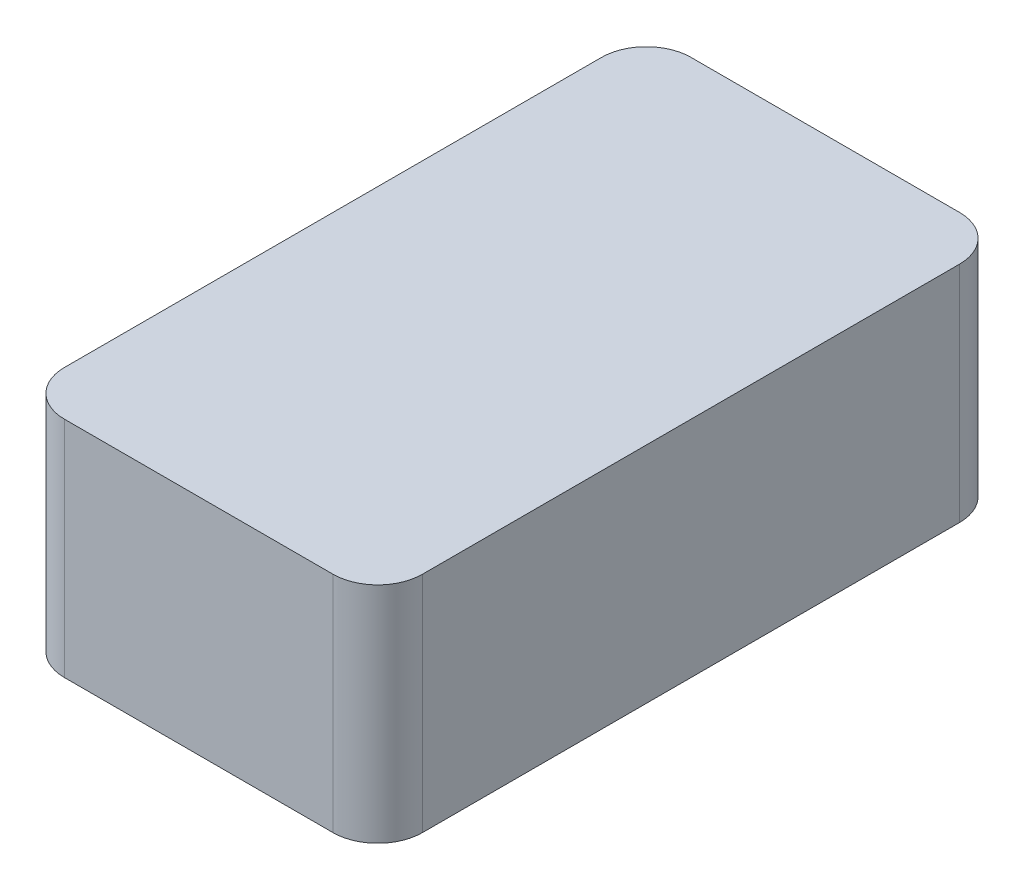
ISO-10303-21;
HEADER;
FILE_DESCRIPTION(('STEP AP214'),'2;1');
FILE_NAME('part.step','',(''),(''),'','','');
FILE_SCHEMA(('AUTOMOTIVE_DESIGN { 1 0 10303 214 1 1 1 1 }'));
ENDSEC;
DATA;
#1=APPLICATION_CONTEXT('core data for automotive mechanical design processes');
#2=APPLICATION_PROTOCOL_DEFINITION('international standard','automotive_design',2000,#1);
#3=PRODUCT_CONTEXT('',#1,'mechanical');
#4=PRODUCT('Part','Part','',(#3));
#5=PRODUCT_RELATED_PRODUCT_CATEGORY('part','',(#4));
#6=PRODUCT_DEFINITION_FORMATION('','',#4);
#7=PRODUCT_DEFINITION_CONTEXT('part definition',#1,'design');
#8=PRODUCT_DEFINITION('design','',#6,#7);
#9=PRODUCT_DEFINITION_SHAPE('','',#8);
#10=(LENGTH_UNIT() NAMED_UNIT(*) SI_UNIT(.MILLI.,.METRE.));
#11=(NAMED_UNIT(*) PLANE_ANGLE_UNIT() SI_UNIT($,.RADIAN.));
#12=(NAMED_UNIT(*) SI_UNIT($,.STERADIAN.) SOLID_ANGLE_UNIT());
#13=UNCERTAINTY_MEASURE_WITH_UNIT(LENGTH_MEASURE(1.E-05),#10,'distance_accuracy_value','');
#14=(GEOMETRIC_REPRESENTATION_CONTEXT(3) GLOBAL_UNCERTAINTY_ASSIGNED_CONTEXT((#13)) GLOBAL_UNIT_ASSIGNED_CONTEXT((#10,
#11,#12)) REPRESENTATION_CONTEXT('',''));
#15=CARTESIAN_POINT('',(0.,0.,0.));
#16=DIRECTION('',(0.,0.,1.));
#17=DIRECTION('',(1.,0.,0.));
#18=AXIS2_PLACEMENT_3D('',#15,#16,#17);
#19=CARTESIAN_POINT('',(40.,50.,-70.));
#20=DIRECTION('',(-1.,0.,0.));
#21=DIRECTION('',(0.,0.,1.));
#22=AXIS2_PLACEMENT_3D('',#19,#20,#21);
#23=PLANE('',#22);
#24=DIRECTION('',(0.,0.,-1.));
#25=VECTOR('',#24,1.);
#26=CARTESIAN_POINT('',(40.,0.,-70.));
#27=LINE('',#26,#25);
#28=CARTESIAN_POINT('',(40.,0.,60.));
#29=VERTEX_POINT('',#28);
#30=CARTESIAN_POINT('',(40.,0.,-60.));
#31=VERTEX_POINT('',#30);
#32=EDGE_CURVE('E131',#29,#31,#27,.T.);
#33=ORIENTED_EDGE('',*,*,#32,.T.);
#34=DIRECTION('',(0.,-1.,0.));
#35=VECTOR('',#34,1.);
#36=CARTESIAN_POINT('',(40.,50.,-60.));
#37=LINE('',#36,#35);
#38=CARTESIAN_POINT('',(40.,50.,-60.));
#39=VERTEX_POINT('',#38);
#40=EDGE_CURVE('E154',#31,#39,#37,.F.);
#41=ORIENTED_EDGE('',*,*,#40,.T.);
#42=DIRECTION('',(0.,0.,-1.));
#43=VECTOR('',#42,1.);
#44=CARTESIAN_POINT('',(40.,50.,-70.));
#45=LINE('',#44,#43);
#46=CARTESIAN_POINT('',(40.,50.,60.));
#47=VERTEX_POINT('',#46);
#48=EDGE_CURVE('E129',#47,#39,#45,.T.);
#49=ORIENTED_EDGE('',*,*,#48,.F.);
#50=DIRECTION('',(0.,-1.,0.));
#51=VECTOR('',#50,1.);
#52=CARTESIAN_POINT('',(40.,50.,60.));
#53=LINE('',#52,#51);
#54=EDGE_CURVE('E151',#47,#29,#53,.T.);
#55=ORIENTED_EDGE('',*,*,#54,.T.);
#56=EDGE_LOOP('',(#33,#41,#49,#55));
#57=FACE_BOUND('',#56,.T.);
#58=ADVANCED_FACE('F36',(#57),#23,.F.);
#59=CARTESIAN_POINT('',(-40.,50.,-70.));
#60=DIRECTION('',(0.,0.,1.));
#61=DIRECTION('',(1.,0.,0.));
#62=AXIS2_PLACEMENT_3D('',#59,#60,#61);
#63=PLANE('',#62);
#64=DIRECTION('',(-1.,0.,0.));
#65=VECTOR('',#64,1.);
#66=CARTESIAN_POINT('',(-40.,0.,-70.));
#67=LINE('',#66,#65);
#68=CARTESIAN_POINT('',(30.,0.,-70.));
#69=VERTEX_POINT('',#68);
#70=CARTESIAN_POINT('',(-30.,0.,-70.));
#71=VERTEX_POINT('',#70);
#72=EDGE_CURVE('E127',#69,#71,#67,.T.);
#73=ORIENTED_EDGE('',*,*,#72,.T.);
#74=DIRECTION('',(0.,-1.,0.));
#75=VECTOR('',#74,1.);
#76=CARTESIAN_POINT('',(-30.,50.,-70.));
#77=LINE('',#76,#75);
#78=CARTESIAN_POINT('',(-30.,50.,-70.));
#79=VERTEX_POINT('',#78);
#80=EDGE_CURVE('E106',#71,#79,#77,.F.);
#81=ORIENTED_EDGE('',*,*,#80,.T.);
#82=DIRECTION('',(-1.,0.,0.));
#83=VECTOR('',#82,1.);
#84=CARTESIAN_POINT('',(-40.,50.,-70.));
#85=LINE('',#84,#83);
#86=CARTESIAN_POINT('',(30.,50.,-70.));
#87=VERTEX_POINT('',#86);
#88=EDGE_CURVE('E170',#87,#79,#85,.T.);
#89=ORIENTED_EDGE('',*,*,#88,.F.);
#90=DIRECTION('',(0.,-1.,0.));
#91=VECTOR('',#90,1.);
#92=CARTESIAN_POINT('',(30.,50.,-70.));
#93=LINE('',#92,#91);
#94=EDGE_CURVE('E111',#87,#69,#93,.T.);
#95=ORIENTED_EDGE('',*,*,#94,.T.);
#96=EDGE_LOOP('',(#73,#81,#89,#95));
#97=FACE_BOUND('',#96,.T.);
#98=ADVANCED_FACE('F187',(#97),#63,.F.);
#99=CARTESIAN_POINT('',(-40.,50.,-70.));
#100=DIRECTION('',(1.,0.,0.));
#101=DIRECTION('',(0.,0.,-1.));
#102=AXIS2_PLACEMENT_3D('',#99,#100,#101);
#103=PLANE('',#102);
#104=DIRECTION('',(0.,0.,1.));
#105=VECTOR('',#104,1.);
#106=CARTESIAN_POINT('',(-40.,50.,-70.));
#107=LINE('',#106,#105);
#108=CARTESIAN_POINT('',(-40.,50.,-60.));
#109=VERTEX_POINT('',#108);
#110=CARTESIAN_POINT('',(-40.,50.,60.));
#111=VERTEX_POINT('',#110);
#112=EDGE_CURVE('E120',#109,#111,#107,.T.);
#113=ORIENTED_EDGE('',*,*,#112,.F.);
#114=DIRECTION('',(0.,-1.,0.));
#115=VECTOR('',#114,1.);
#116=CARTESIAN_POINT('',(-40.,50.,-60.));
#117=LINE('',#116,#115);
#118=CARTESIAN_POINT('',(-40.,0.,-60.));
#119=VERTEX_POINT('',#118);
#120=EDGE_CURVE('E105',#109,#119,#117,.T.);
#121=ORIENTED_EDGE('',*,*,#120,.T.);
#122=DIRECTION('',(0.,0.,1.));
#123=VECTOR('',#122,1.);
#124=CARTESIAN_POINT('',(-40.,0.,-70.));
#125=LINE('',#124,#123);
#126=CARTESIAN_POINT('',(-40.,0.,60.));
#127=VERTEX_POINT('',#126);
#128=EDGE_CURVE('E118',#119,#127,#125,.T.);
#129=ORIENTED_EDGE('',*,*,#128,.T.);
#130=DIRECTION('',(0.,-1.,0.));
#131=VECTOR('',#130,1.);
#132=CARTESIAN_POINT('',(-40.,50.,60.));
#133=LINE('',#132,#131);
#134=EDGE_CURVE('E122',#127,#111,#133,.F.);
#135=ORIENTED_EDGE('',*,*,#134,.T.);
#136=EDGE_LOOP('',(#113,#121,#129,#135));
#137=FACE_BOUND('',#136,.T.);
#138=ADVANCED_FACE('F117',(#137),#103,.F.);
#139=CARTESIAN_POINT('',(-40.,50.,70.));
#140=DIRECTION('',(0.,0.,-1.));
#141=DIRECTION('',(-1.,0.,0.));
#142=AXIS2_PLACEMENT_3D('',#139,#140,#141);
#143=PLANE('',#142);
#144=DIRECTION('',(1.,0.,0.));
#145=VECTOR('',#144,1.);
#146=CARTESIAN_POINT('',(-40.,0.,70.));
#147=LINE('',#146,#145);
#148=CARTESIAN_POINT('',(-30.,0.,70.));
#149=VERTEX_POINT('',#148);
#150=CARTESIAN_POINT('',(30.,0.,70.));
#151=VERTEX_POINT('',#150);
#152=EDGE_CURVE('E126',#149,#151,#147,.T.);
#153=ORIENTED_EDGE('',*,*,#152,.T.);
#154=DIRECTION('',(0.,-1.,0.));
#155=VECTOR('',#154,1.);
#156=CARTESIAN_POINT('',(30.,50.,70.));
#157=LINE('',#156,#155);
#158=CARTESIAN_POINT('',(30.,50.,70.));
#159=VERTEX_POINT('',#158);
#160=EDGE_CURVE('E11',#151,#159,#157,.F.);
#161=ORIENTED_EDGE('',*,*,#160,.T.);
#162=DIRECTION('',(1.,0.,0.));
#163=VECTOR('',#162,1.);
#164=CARTESIAN_POINT('',(-40.,50.,70.));
#165=LINE('',#164,#163);
#166=CARTESIAN_POINT('',(-30.,50.,70.));
#167=VERTEX_POINT('',#166);
#168=EDGE_CURVE('E135',#167,#159,#165,.T.);
#169=ORIENTED_EDGE('',*,*,#168,.F.);
#170=DIRECTION('',(0.,-1.,0.));
#171=VECTOR('',#170,1.);
#172=CARTESIAN_POINT('',(-30.,50.,70.));
#173=LINE('',#172,#171);
#174=EDGE_CURVE('E44',#167,#149,#173,.T.);
#175=ORIENTED_EDGE('',*,*,#174,.T.);
#176=EDGE_LOOP('',(#153,#161,#169,#175));
#177=FACE_BOUND('',#176,.T.);
#178=ADVANCED_FACE('F157',(#177),#143,.F.);
#179=CARTESIAN_POINT('',(0.,50.,0.));
#180=DIRECTION('',(0.,1.,0.));
#181=DIRECTION('',(0.,0.,1.));
#182=AXIS2_PLACEMENT_3D('',#179,#180,#181);
#183=PLANE('',#182);
#184=ORIENTED_EDGE('',*,*,#88,.T.);
#185=CARTESIAN_POINT('',(-30.,50.,-60.));
#186=DIRECTION('',(0.,1.,0.));
#187=DIRECTION('',(0.,0.,1.));
#188=AXIS2_PLACEMENT_3D('',#185,#186,#187);
#189=CIRCLE('',#188,10.);
#190=EDGE_CURVE('E149',#79,#109,#189,.T.);
#191=ORIENTED_EDGE('',*,*,#190,.T.);
#192=ORIENTED_EDGE('',*,*,#112,.T.);
#193=CARTESIAN_POINT('',(-30.,50.,60.));
#194=DIRECTION('',(0.,1.,0.));
#195=DIRECTION('',(0.,0.,1.));
#196=AXIS2_PLACEMENT_3D('',#193,#194,#195);
#197=CIRCLE('',#196,10.);
#198=EDGE_CURVE('E56',#111,#167,#197,.T.);
#199=ORIENTED_EDGE('',*,*,#198,.T.);
#200=ORIENTED_EDGE('',*,*,#168,.T.);
#201=CARTESIAN_POINT('',(30.,50.,60.));
#202=DIRECTION('',(0.,1.,0.));
#203=DIRECTION('',(0.,0.,1.));
#204=AXIS2_PLACEMENT_3D('',#201,#202,#203);
#205=CIRCLE('',#204,10.);
#206=EDGE_CURVE('E145',#159,#47,#205,.T.);
#207=ORIENTED_EDGE('',*,*,#206,.T.);
#208=ORIENTED_EDGE('',*,*,#48,.T.);
#209=CARTESIAN_POINT('',(30.,50.,-60.));
#210=DIRECTION('',(0.,1.,0.));
#211=DIRECTION('',(0.,0.,1.));
#212=AXIS2_PLACEMENT_3D('',#209,#210,#211);
#213=CIRCLE('',#212,10.);
#214=EDGE_CURVE('E147',#39,#87,#213,.T.);
#215=ORIENTED_EDGE('',*,*,#214,.T.);
#216=EDGE_LOOP('',(#184,#191,#192,#199,#200,#207,#208,#215));
#217=FACE_BOUND('',#216,.T.);
#218=ADVANCED_FACE('F176',(#217),#183,.T.);
#219=CARTESIAN_POINT('',(0.,0.,0.));
#220=DIRECTION('',(0.,1.,0.));
#221=DIRECTION('',(0.,0.,1.));
#222=AXIS2_PLACEMENT_3D('',#219,#220,#221);
#223=PLANE('',#222);
#224=ORIENTED_EDGE('',*,*,#128,.F.);
#225=CARTESIAN_POINT('',(-30.,0.,-60.));
#226=DIRECTION('',(0.,1.,0.));
#227=DIRECTION('',(0.,0.,1.));
#228=AXIS2_PLACEMENT_3D('',#225,#226,#227);
#229=CIRCLE('',#228,10.);
#230=EDGE_CURVE('E101',#119,#71,#229,.F.);
#231=ORIENTED_EDGE('',*,*,#230,.T.);
#232=ORIENTED_EDGE('',*,*,#72,.F.);
#233=CARTESIAN_POINT('',(30.,0.,-60.));
#234=DIRECTION('',(0.,1.,0.));
#235=DIRECTION('',(0.,0.,1.));
#236=AXIS2_PLACEMENT_3D('',#233,#234,#235);
#237=CIRCLE('',#236,10.);
#238=EDGE_CURVE('E112',#69,#31,#237,.F.);
#239=ORIENTED_EDGE('',*,*,#238,.T.);
#240=ORIENTED_EDGE('',*,*,#32,.F.);
#241=CARTESIAN_POINT('',(30.,0.,60.));
#242=DIRECTION('',(0.,1.,0.));
#243=DIRECTION('',(0.,0.,1.));
#244=AXIS2_PLACEMENT_3D('',#241,#242,#243);
#245=CIRCLE('',#244,10.);
#246=EDGE_CURVE('E138',#29,#151,#245,.F.);
#247=ORIENTED_EDGE('',*,*,#246,.T.);
#248=ORIENTED_EDGE('',*,*,#152,.F.);
#249=CARTESIAN_POINT('',(-30.,0.,60.));
#250=DIRECTION('',(0.,1.,0.));
#251=DIRECTION('',(0.,0.,1.));
#252=AXIS2_PLACEMENT_3D('',#249,#250,#251);
#253=CIRCLE('',#252,10.);
#254=EDGE_CURVE('E121',#149,#127,#253,.F.);
#255=ORIENTED_EDGE('',*,*,#254,.T.);
#256=EDGE_LOOP('',(#224,#231,#232,#239,#240,#247,#248,#255));
#257=FACE_BOUND('',#256,.T.);
#258=ADVANCED_FACE('F124',(#257),#223,.F.);
#259=CARTESIAN_POINT('',(-30.,50.,-60.));
#260=DIRECTION('',(0.,-1.,0.));
#261=DIRECTION('',(0.,0.,-1.));
#262=AXIS2_PLACEMENT_3D('',#259,#260,#261);
#263=CYLINDRICAL_SURFACE('',#262,10.);
#264=ORIENTED_EDGE('',*,*,#190,.F.);
#265=ORIENTED_EDGE('',*,*,#80,.F.);
#266=ORIENTED_EDGE('',*,*,#230,.F.);
#267=ORIENTED_EDGE('',*,*,#120,.F.);
#268=EDGE_LOOP('',(#264,#265,#266,#267));
#269=FACE_BOUND('',#268,.T.);
#270=ADVANCED_FACE('F104',(#269),#263,.T.);
#271=CARTESIAN_POINT('',(30.,50.,-60.));
#272=DIRECTION('',(0.,-1.,0.));
#273=DIRECTION('',(0.,0.,-1.));
#274=AXIS2_PLACEMENT_3D('',#271,#272,#273);
#275=CYLINDRICAL_SURFACE('',#274,10.);
#276=ORIENTED_EDGE('',*,*,#214,.F.);
#277=ORIENTED_EDGE('',*,*,#40,.F.);
#278=ORIENTED_EDGE('',*,*,#238,.F.);
#279=ORIENTED_EDGE('',*,*,#94,.F.);
#280=EDGE_LOOP('',(#276,#277,#278,#279));
#281=FACE_BOUND('',#280,.T.);
#282=ADVANCED_FACE('F198',(#281),#275,.T.);
#283=CARTESIAN_POINT('',(30.,50.,60.));
#284=DIRECTION('',(0.,-1.,0.));
#285=DIRECTION('',(0.,0.,-1.));
#286=AXIS2_PLACEMENT_3D('',#283,#284,#285);
#287=CYLINDRICAL_SURFACE('',#286,10.);
#288=ORIENTED_EDGE('',*,*,#206,.F.);
#289=ORIENTED_EDGE('',*,*,#160,.F.);
#290=ORIENTED_EDGE('',*,*,#246,.F.);
#291=ORIENTED_EDGE('',*,*,#54,.F.);
#292=EDGE_LOOP('',(#288,#289,#290,#291));
#293=FACE_BOUND('',#292,.T.);
#294=ADVANCED_FACE('F164',(#293),#287,.T.);
#295=CARTESIAN_POINT('',(-30.,50.,60.));
#296=DIRECTION('',(0.,-1.,0.));
#297=DIRECTION('',(0.,0.,-1.));
#298=AXIS2_PLACEMENT_3D('',#295,#296,#297);
#299=CYLINDRICAL_SURFACE('',#298,10.);
#300=ORIENTED_EDGE('',*,*,#198,.F.);
#301=ORIENTED_EDGE('',*,*,#134,.F.);
#302=ORIENTED_EDGE('',*,*,#254,.F.);
#303=ORIENTED_EDGE('',*,*,#174,.F.);
#304=EDGE_LOOP('',(#300,#301,#302,#303));
#305=FACE_BOUND('',#304,.T.);
#306=ADVANCED_FACE('F38',(#305),#299,.T.);
#307=CLOSED_SHELL('',(#58,#98,#138,#178,#218,#258,#270,#282,#294,#306));
#308=MANIFOLD_SOLID_BREP('B2',#307);
#309=ADVANCED_BREP_SHAPE_REPRESENTATION('',(#18,#308),#14);
#310=SHAPE_DEFINITION_REPRESENTATION(#9,#309);
ENDSEC;
END-ISO-10303-21;
